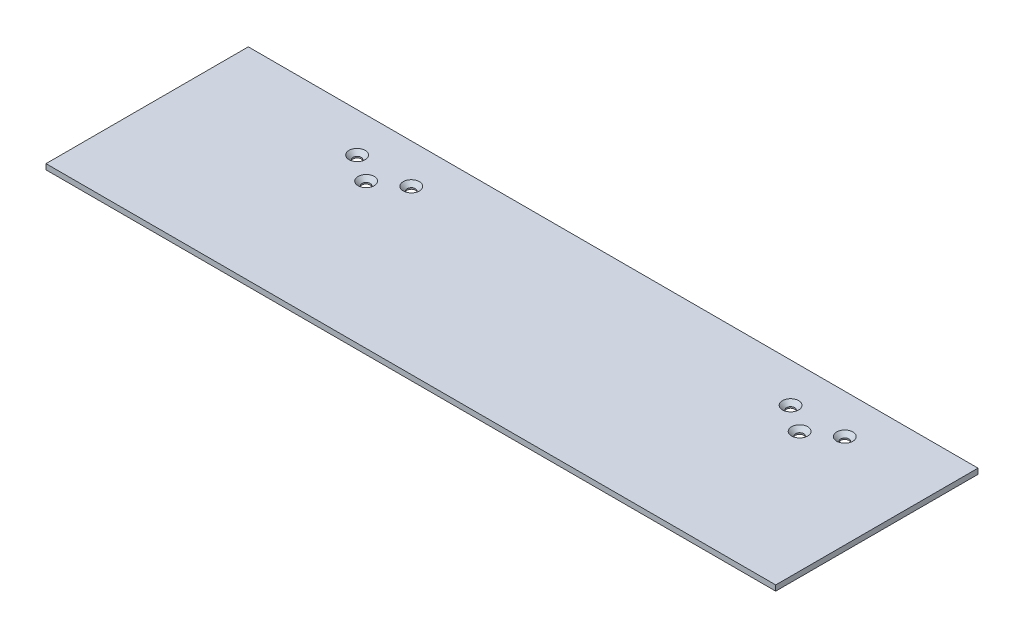
ISO-10303-21;
HEADER;
FILE_DESCRIPTION(('STEP AP214'),'2;1');
FILE_NAME('part.step','',(''),(''),'','','');
FILE_SCHEMA(('AUTOMOTIVE_DESIGN { 1 0 10303 214 1 1 1 1 }'));
ENDSEC;
DATA;
#1=APPLICATION_CONTEXT('core data for automotive mechanical design processes');
#2=APPLICATION_PROTOCOL_DEFINITION('international standard','automotive_design',2000,#1);
#3=PRODUCT_CONTEXT('',#1,'mechanical');
#4=PRODUCT('Part','Part','',(#3));
#5=PRODUCT_RELATED_PRODUCT_CATEGORY('part','',(#4));
#6=PRODUCT_DEFINITION_FORMATION('','',#4);
#7=PRODUCT_DEFINITION_CONTEXT('part definition',#1,'design');
#8=PRODUCT_DEFINITION('design','',#6,#7);
#9=PRODUCT_DEFINITION_SHAPE('','',#8);
#10=(LENGTH_UNIT() NAMED_UNIT(*) SI_UNIT(.MILLI.,.METRE.));
#11=(NAMED_UNIT(*) PLANE_ANGLE_UNIT() SI_UNIT($,.RADIAN.));
#12=(NAMED_UNIT(*) SI_UNIT($,.STERADIAN.) SOLID_ANGLE_UNIT());
#13=UNCERTAINTY_MEASURE_WITH_UNIT(LENGTH_MEASURE(1.E-05),#10,'distance_accuracy_value','');
#14=(GEOMETRIC_REPRESENTATION_CONTEXT(3) GLOBAL_UNCERTAINTY_ASSIGNED_CONTEXT((#13)) GLOBAL_UNIT_ASSIGNED_CONTEXT((#10,
#11,#12)) REPRESENTATION_CONTEXT('',''));
#15=CARTESIAN_POINT('',(0.,0.,0.));
#16=DIRECTION('',(0.,0.,1.));
#17=DIRECTION('',(1.,0.,0.));
#18=AXIS2_PLACEMENT_3D('',#15,#16,#17);
#19=CARTESIAN_POINT('',(0.,3.,0.));
#20=DIRECTION('',(0.,-1.,0.));
#21=DIRECTION('',(0.,0.,-1.));
#22=AXIS2_PLACEMENT_3D('',#19,#20,#21);
#23=PLANE('',#22);
#24=CARTESIAN_POINT('',(-90.,3.,-34.25));
#25=DIRECTION('',(0.,1.,0.));
#26=DIRECTION('',(0.,0.,1.));
#27=AXIS2_PLACEMENT_3D('',#24,#25,#26);
#28=CIRCLE('',#27,4.48000000000001);
#29=CARTESIAN_POINT('',(-90.,3.,-29.77));
#30=VERTEX_POINT('',#29);
#31=EDGE_CURVE('E196',#30,#30,#28,.T.);
#32=ORIENTED_EDGE('',*,*,#31,.F.);
#33=EDGE_LOOP('',(#32));
#34=FACE_BOUND('',#33,.T.);
#35=CARTESIAN_POINT('',(-105.,3.,-24.25));
#36=DIRECTION('',(0.,1.,0.));
#37=DIRECTION('',(0.,0.,1.));
#38=AXIS2_PLACEMENT_3D('',#35,#36,#37);
#39=CIRCLE('',#38,4.48000000000001);
#40=CARTESIAN_POINT('',(-105.,3.,-19.77));
#41=VERTEX_POINT('',#40);
#42=EDGE_CURVE('E184',#41,#41,#39,.T.);
#43=ORIENTED_EDGE('',*,*,#42,.F.);
#44=EDGE_LOOP('',(#43));
#45=FACE_BOUND('',#44,.T.);
#46=CARTESIAN_POINT('',(-120.,3.,-34.25));
#47=DIRECTION('',(0.,1.,0.));
#48=DIRECTION('',(0.,0.,1.));
#49=AXIS2_PLACEMENT_3D('',#46,#47,#48);
#50=CIRCLE('',#49,4.48);
#51=CARTESIAN_POINT('',(-120.,3.,-29.77));
#52=VERTEX_POINT('',#51);
#53=EDGE_CURVE('E172',#52,#52,#50,.T.);
#54=ORIENTED_EDGE('',*,*,#53,.F.);
#55=EDGE_LOOP('',(#54));
#56=FACE_BOUND('',#55,.T.);
#57=CARTESIAN_POINT('',(150.,3.,-34.25));
#58=DIRECTION('',(0.,1.,0.));
#59=DIRECTION('',(0.,0.,1.));
#60=AXIS2_PLACEMENT_3D('',#57,#58,#59);
#61=CIRCLE('',#60,4.48000000000001);
#62=CARTESIAN_POINT('',(150.,3.,-29.77));
#63=VERTEX_POINT('',#62);
#64=EDGE_CURVE('E148',#63,#63,#61,.T.);
#65=ORIENTED_EDGE('',*,*,#64,.F.);
#66=EDGE_LOOP('',(#65));
#67=FACE_BOUND('',#66,.T.);
#68=CARTESIAN_POINT('',(135.,3.,-24.25));
#69=DIRECTION('',(0.,1.,0.));
#70=DIRECTION('',(0.,0.,1.));
#71=AXIS2_PLACEMENT_3D('',#68,#69,#70);
#72=CIRCLE('',#71,4.48000000000001);
#73=CARTESIAN_POINT('',(135.,3.,-19.77));
#74=VERTEX_POINT('',#73);
#75=EDGE_CURVE('E136',#74,#74,#72,.T.);
#76=ORIENTED_EDGE('',*,*,#75,.F.);
#77=EDGE_LOOP('',(#76));
#78=FACE_BOUND('',#77,.T.);
#79=DIRECTION('',(0.,0.,-1.));
#80=VECTOR('',#79,1.);
#81=CARTESIAN_POINT('',(202.,3.,56.));
#82=LINE('',#81,#80);
#83=CARTESIAN_POINT('',(202.,3.,56.));
#84=VERTEX_POINT('',#83);
#85=CARTESIAN_POINT('',(202.,3.,-56.));
#86=VERTEX_POINT('',#85);
#87=EDGE_CURVE('E92',#84,#86,#82,.T.);
#88=ORIENTED_EDGE('',*,*,#87,.T.);
#89=DIRECTION('',(-1.,0.,0.));
#90=VECTOR('',#89,1.);
#91=CARTESIAN_POINT('',(-202.,3.,-56.));
#92=LINE('',#91,#90);
#93=CARTESIAN_POINT('',(-202.,3.,-56.));
#94=VERTEX_POINT('',#93);
#95=EDGE_CURVE('E87',#86,#94,#92,.T.);
#96=ORIENTED_EDGE('',*,*,#95,.T.);
#97=DIRECTION('',(0.,0.,1.));
#98=VECTOR('',#97,1.);
#99=CARTESIAN_POINT('',(-202.,3.,56.));
#100=LINE('',#99,#98);
#101=CARTESIAN_POINT('',(-202.,3.,56.));
#102=VERTEX_POINT('',#101);
#103=EDGE_CURVE('E90',#94,#102,#100,.T.);
#104=ORIENTED_EDGE('',*,*,#103,.T.);
#105=DIRECTION('',(1.,0.,0.));
#106=VECTOR('',#105,1.);
#107=CARTESIAN_POINT('',(-202.,3.,56.));
#108=LINE('',#107,#106);
#109=EDGE_CURVE('E57',#102,#84,#108,.T.);
#110=ORIENTED_EDGE('',*,*,#109,.T.);
#111=EDGE_LOOP('',(#88,#96,#104,#110));
#112=FACE_BOUND('',#111,.T.);
#113=CARTESIAN_POINT('',(120.,3.,-34.25));
#114=DIRECTION('',(0.,1.,0.));
#115=DIRECTION('',(0.,0.,1.));
#116=AXIS2_PLACEMENT_3D('',#113,#114,#115);
#117=CIRCLE('',#116,4.48);
#118=CARTESIAN_POINT('',(120.,3.,-29.77));
#119=VERTEX_POINT('',#118);
#120=EDGE_CURVE('E160',#119,#119,#117,.T.);
#121=ORIENTED_EDGE('',*,*,#120,.F.);
#122=EDGE_LOOP('',(#121));
#123=FACE_BOUND('',#122,.T.);
#124=ADVANCED_FACE('F39',(#34,#45,#56,#67,#78,#112,#123),#23,.F.);
#125=CARTESIAN_POINT('',(202.,3.,56.));
#126=DIRECTION('',(-1.,0.,0.));
#127=DIRECTION('',(0.,0.,1.));
#128=AXIS2_PLACEMENT_3D('',#125,#126,#127);
#129=PLANE('',#128);
#130=DIRECTION('',(0.,0.,-1.));
#131=VECTOR('',#130,1.);
#132=CARTESIAN_POINT('',(202.,0.,56.));
#133=LINE('',#132,#131);
#134=CARTESIAN_POINT('',(202.,0.,56.));
#135=VERTEX_POINT('',#134);
#136=CARTESIAN_POINT('',(202.,0.,-56.));
#137=VERTEX_POINT('',#136);
#138=EDGE_CURVE('E108',#135,#137,#133,.T.);
#139=ORIENTED_EDGE('',*,*,#138,.T.);
#140=DIRECTION('',(0.,-1.,0.));
#141=VECTOR('',#140,1.);
#142=CARTESIAN_POINT('',(202.,3.,-56.));
#143=LINE('',#142,#141);
#144=EDGE_CURVE('E11',#86,#137,#143,.T.);
#145=ORIENTED_EDGE('',*,*,#144,.F.);
#146=ORIENTED_EDGE('',*,*,#87,.F.);
#147=DIRECTION('',(0.,-1.,0.));
#148=VECTOR('',#147,1.);
#149=CARTESIAN_POINT('',(202.,3.,56.));
#150=LINE('',#149,#148);
#151=EDGE_CURVE('E104',#84,#135,#150,.T.);
#152=ORIENTED_EDGE('',*,*,#151,.T.);
#153=EDGE_LOOP('',(#139,#145,#146,#152));
#154=FACE_BOUND('',#153,.T.);
#155=ADVANCED_FACE('F41',(#154),#129,.F.);
#156=CARTESIAN_POINT('',(-202.,3.,-56.));
#157=DIRECTION('',(0.,0.,1.));
#158=DIRECTION('',(1.,0.,0.));
#159=AXIS2_PLACEMENT_3D('',#156,#157,#158);
#160=PLANE('',#159);
#161=DIRECTION('',(-1.,0.,0.));
#162=VECTOR('',#161,1.);
#163=CARTESIAN_POINT('',(-202.,0.,-56.));
#164=LINE('',#163,#162);
#165=CARTESIAN_POINT('',(-202.,0.,-56.));
#166=VERTEX_POINT('',#165);
#167=EDGE_CURVE('E97',#137,#166,#164,.T.);
#168=ORIENTED_EDGE('',*,*,#167,.T.);
#169=DIRECTION('',(0.,-1.,0.));
#170=VECTOR('',#169,1.);
#171=CARTESIAN_POINT('',(-202.,3.,-56.));
#172=LINE('',#171,#170);
#173=EDGE_CURVE('E49',#94,#166,#172,.T.);
#174=ORIENTED_EDGE('',*,*,#173,.F.);
#175=ORIENTED_EDGE('',*,*,#95,.F.);
#176=ORIENTED_EDGE('',*,*,#144,.T.);
#177=EDGE_LOOP('',(#168,#174,#175,#176));
#178=FACE_BOUND('',#177,.T.);
#179=ADVANCED_FACE('F96',(#178),#160,.F.);
#180=CARTESIAN_POINT('',(-202.,3.,56.));
#181=DIRECTION('',(1.,0.,0.));
#182=DIRECTION('',(0.,0.,-1.));
#183=AXIS2_PLACEMENT_3D('',#180,#181,#182);
#184=PLANE('',#183);
#185=DIRECTION('',(0.,0.,1.));
#186=VECTOR('',#185,1.);
#187=CARTESIAN_POINT('',(-202.,0.,56.));
#188=LINE('',#187,#186);
#189=CARTESIAN_POINT('',(-202.,0.,56.));
#190=VERTEX_POINT('',#189);
#191=EDGE_CURVE('E74',#166,#190,#188,.T.);
#192=ORIENTED_EDGE('',*,*,#191,.T.);
#193=DIRECTION('',(0.,-1.,0.));
#194=VECTOR('',#193,1.);
#195=CARTESIAN_POINT('',(-202.,3.,56.));
#196=LINE('',#195,#194);
#197=EDGE_CURVE('E99',#102,#190,#196,.T.);
#198=ORIENTED_EDGE('',*,*,#197,.F.);
#199=ORIENTED_EDGE('',*,*,#103,.F.);
#200=ORIENTED_EDGE('',*,*,#173,.T.);
#201=EDGE_LOOP('',(#192,#198,#199,#200));
#202=FACE_BOUND('',#201,.T.);
#203=ADVANCED_FACE('F100',(#202),#184,.F.);
#204=CARTESIAN_POINT('',(-202.,3.,56.));
#205=DIRECTION('',(0.,0.,-1.));
#206=DIRECTION('',(-1.,0.,0.));
#207=AXIS2_PLACEMENT_3D('',#204,#205,#206);
#208=PLANE('',#207);
#209=DIRECTION('',(1.,0.,0.));
#210=VECTOR('',#209,1.);
#211=CARTESIAN_POINT('',(-202.,0.,56.));
#212=LINE('',#211,#210);
#213=EDGE_CURVE('E80',#190,#135,#212,.T.);
#214=ORIENTED_EDGE('',*,*,#213,.T.);
#215=ORIENTED_EDGE('',*,*,#151,.F.);
#216=ORIENTED_EDGE('',*,*,#109,.F.);
#217=ORIENTED_EDGE('',*,*,#197,.T.);
#218=EDGE_LOOP('',(#214,#215,#216,#217));
#219=FACE_BOUND('',#218,.T.);
#220=ADVANCED_FACE('F122',(#219),#208,.F.);
#221=CARTESIAN_POINT('',(0.,0.,0.));
#222=DIRECTION('',(0.,-1.,0.));
#223=DIRECTION('',(0.,0.,-1.));
#224=AXIS2_PLACEMENT_3D('',#221,#222,#223);
#225=PLANE('',#224);
#226=CARTESIAN_POINT('',(-90.,0.,-34.25));
#227=DIRECTION('',(0.,1.,0.));
#228=DIRECTION('',(0.,0.,1.));
#229=AXIS2_PLACEMENT_3D('',#226,#227,#228);
#230=CIRCLE('',#229,2.24999999999997);
#231=CARTESIAN_POINT('',(-90.,0.,-32.));
#232=VERTEX_POINT('',#231);
#233=EDGE_CURVE('E192',#232,#232,#230,.T.);
#234=ORIENTED_EDGE('',*,*,#233,.T.);
#235=EDGE_LOOP('',(#234));
#236=FACE_BOUND('',#235,.T.);
#237=CARTESIAN_POINT('',(-105.,0.,-24.25));
#238=DIRECTION('',(0.,1.,0.));
#239=DIRECTION('',(0.,0.,1.));
#240=AXIS2_PLACEMENT_3D('',#237,#238,#239);
#241=CIRCLE('',#240,2.24999999999997);
#242=CARTESIAN_POINT('',(-105.,0.,-22.));
#243=VERTEX_POINT('',#242);
#244=EDGE_CURVE('E180',#243,#243,#241,.T.);
#245=ORIENTED_EDGE('',*,*,#244,.T.);
#246=EDGE_LOOP('',(#245));
#247=FACE_BOUND('',#246,.T.);
#248=CARTESIAN_POINT('',(-120.,0.,-34.25));
#249=DIRECTION('',(0.,1.,0.));
#250=DIRECTION('',(0.,0.,1.));
#251=AXIS2_PLACEMENT_3D('',#248,#249,#250);
#252=CIRCLE('',#251,2.24999999999999);
#253=CARTESIAN_POINT('',(-120.,0.,-32.));
#254=VERTEX_POINT('',#253);
#255=EDGE_CURVE('E168',#254,#254,#252,.T.);
#256=ORIENTED_EDGE('',*,*,#255,.T.);
#257=EDGE_LOOP('',(#256));
#258=FACE_BOUND('',#257,.T.);
#259=CARTESIAN_POINT('',(120.,0.,-34.25));
#260=DIRECTION('',(0.,1.,0.));
#261=DIRECTION('',(0.,0.,1.));
#262=AXIS2_PLACEMENT_3D('',#259,#260,#261);
#263=CIRCLE('',#262,2.24999999999999);
#264=CARTESIAN_POINT('',(120.,0.,-32.));
#265=VERTEX_POINT('',#264);
#266=EDGE_CURVE('E152',#265,#265,#263,.T.);
#267=ORIENTED_EDGE('',*,*,#266,.T.);
#268=EDGE_LOOP('',(#267));
#269=FACE_BOUND('',#268,.T.);
#270=CARTESIAN_POINT('',(150.,0.,-34.25));
#271=DIRECTION('',(0.,1.,0.));
#272=DIRECTION('',(0.,0.,1.));
#273=AXIS2_PLACEMENT_3D('',#270,#271,#272);
#274=CIRCLE('',#273,2.24999999999997);
#275=CARTESIAN_POINT('',(150.,0.,-32.));
#276=VERTEX_POINT('',#275);
#277=EDGE_CURVE('E140',#276,#276,#274,.T.);
#278=ORIENTED_EDGE('',*,*,#277,.T.);
#279=EDGE_LOOP('',(#278));
#280=FACE_BOUND('',#279,.T.);
#281=CARTESIAN_POINT('',(135.,0.,-24.25));
#282=DIRECTION('',(0.,1.,0.));
#283=DIRECTION('',(0.,0.,1.));
#284=AXIS2_PLACEMENT_3D('',#281,#282,#283);
#285=CIRCLE('',#284,2.24999999999997);
#286=CARTESIAN_POINT('',(135.,0.,-22.));
#287=VERTEX_POINT('',#286);
#288=EDGE_CURVE('E112',#287,#287,#285,.T.);
#289=ORIENTED_EDGE('',*,*,#288,.T.);
#290=EDGE_LOOP('',(#289));
#291=FACE_BOUND('',#290,.T.);
#292=ORIENTED_EDGE('',*,*,#138,.F.);
#293=ORIENTED_EDGE('',*,*,#213,.F.);
#294=ORIENTED_EDGE('',*,*,#191,.F.);
#295=ORIENTED_EDGE('',*,*,#167,.F.);
#296=EDGE_LOOP('',(#292,#293,#294,#295));
#297=FACE_BOUND('',#296,.T.);
#298=ADVANCED_FACE('F125',(#236,#247,#258,#269,#280,#291,#297),#225,.T.);
#299=CARTESIAN_POINT('',(135.,3.,-24.25));
#300=DIRECTION('',(0.,1.,0.));
#301=DIRECTION('',(0.,0.,1.));
#302=AXIS2_PLACEMENT_3D('',#299,#300,#301);
#303=CYLINDRICAL_SURFACE('',#302,2.24999999999999);
#304=ORIENTED_EDGE('',*,*,#288,.F.);
#305=EDGE_LOOP('',(#304));
#306=FACE_BOUND('',#305,.T.);
#307=CARTESIAN_POINT('',(135.,0.769999999999999,-24.25));
#308=DIRECTION('',(0.,1.,0.));
#309=DIRECTION('',(0.,0.,1.));
#310=AXIS2_PLACEMENT_3D('',#307,#308,#309);
#311=CIRCLE('',#310,2.25);
#312=CARTESIAN_POINT('',(135.,0.769999999999999,-22.));
#313=VERTEX_POINT('',#312);
#314=EDGE_CURVE('E132',#313,#313,#311,.T.);
#315=ORIENTED_EDGE('',*,*,#314,.T.);
#316=EDGE_LOOP('',(#315));
#317=FACE_BOUND('',#316,.T.);
#318=ADVANCED_FACE('F217',(#306,#317),#303,.F.);
#319=CARTESIAN_POINT('',(135.,3.,-24.25));
#320=DIRECTION('',(0.,1.,0.));
#321=DIRECTION('',(0.,0.,1.));
#322=AXIS2_PLACEMENT_3D('',#319,#320,#321);
#323=CONICAL_SURFACE('',#322,4.48000000000001,0.78539816339745);
#324=ORIENTED_EDGE('',*,*,#314,.F.);
#325=EDGE_LOOP('',(#324));
#326=FACE_BOUND('',#325,.T.);
#327=ORIENTED_EDGE('',*,*,#75,.T.);
#328=EDGE_LOOP('',(#327));
#329=FACE_BOUND('',#328,.T.);
#330=ADVANCED_FACE('F214',(#326,#329),#323,.F.);
#331=CARTESIAN_POINT('',(150.,3.,-34.25));
#332=DIRECTION('',(0.,1.,0.));
#333=DIRECTION('',(0.,0.,1.));
#334=AXIS2_PLACEMENT_3D('',#331,#332,#333);
#335=CYLINDRICAL_SURFACE('',#334,2.24999999999999);
#336=ORIENTED_EDGE('',*,*,#277,.F.);
#337=EDGE_LOOP('',(#336));
#338=FACE_BOUND('',#337,.T.);
#339=CARTESIAN_POINT('',(150.,0.769999999999999,-34.25));
#340=DIRECTION('',(0.,1.,0.));
#341=DIRECTION('',(0.,0.,1.));
#342=AXIS2_PLACEMENT_3D('',#339,#340,#341);
#343=CIRCLE('',#342,2.25);
#344=CARTESIAN_POINT('',(150.,0.769999999999999,-32.));
#345=VERTEX_POINT('',#344);
#346=EDGE_CURVE('E144',#345,#345,#343,.T.);
#347=ORIENTED_EDGE('',*,*,#346,.T.);
#348=EDGE_LOOP('',(#347));
#349=FACE_BOUND('',#348,.T.);
#350=ADVANCED_FACE('F216',(#338,#349),#335,.F.);
#351=CARTESIAN_POINT('',(150.,3.,-34.25));
#352=DIRECTION('',(0.,1.,0.));
#353=DIRECTION('',(0.,0.,1.));
#354=AXIS2_PLACEMENT_3D('',#351,#352,#353);
#355=CONICAL_SURFACE('',#354,4.48000000000001,0.78539816339745);
#356=ORIENTED_EDGE('',*,*,#346,.F.);
#357=EDGE_LOOP('',(#356));
#358=FACE_BOUND('',#357,.T.);
#359=ORIENTED_EDGE('',*,*,#64,.T.);
#360=EDGE_LOOP('',(#359));
#361=FACE_BOUND('',#360,.T.);
#362=ADVANCED_FACE('F224',(#358,#361),#355,.F.);
#363=CARTESIAN_POINT('',(120.,3.,-34.25));
#364=DIRECTION('',(0.,1.,0.));
#365=DIRECTION('',(0.,0.,1.));
#366=AXIS2_PLACEMENT_3D('',#363,#364,#365);
#367=CYLINDRICAL_SURFACE('',#366,2.25);
#368=ORIENTED_EDGE('',*,*,#266,.F.);
#369=EDGE_LOOP('',(#368));
#370=FACE_BOUND('',#369,.T.);
#371=CARTESIAN_POINT('',(120.,0.769999999999999,-34.25));
#372=DIRECTION('',(0.,1.,0.));
#373=DIRECTION('',(0.,0.,1.));
#374=AXIS2_PLACEMENT_3D('',#371,#372,#373);
#375=CIRCLE('',#374,2.25);
#376=CARTESIAN_POINT('',(120.,0.769999999999999,-32.));
#377=VERTEX_POINT('',#376);
#378=EDGE_CURVE('E156',#377,#377,#375,.T.);
#379=ORIENTED_EDGE('',*,*,#378,.T.);
#380=EDGE_LOOP('',(#379));
#381=FACE_BOUND('',#380,.T.);
#382=ADVANCED_FACE('F328',(#370,#381),#367,.F.);
#383=CARTESIAN_POINT('',(120.,3.,-34.25));
#384=DIRECTION('',(0.,1.,0.));
#385=DIRECTION('',(0.,0.,1.));
#386=AXIS2_PLACEMENT_3D('',#383,#384,#385);
#387=CONICAL_SURFACE('',#386,4.48,0.785398163397447);
#388=ORIENTED_EDGE('',*,*,#378,.F.);
#389=EDGE_LOOP('',(#388));
#390=FACE_BOUND('',#389,.T.);
#391=ORIENTED_EDGE('',*,*,#120,.T.);
#392=EDGE_LOOP('',(#391));
#393=FACE_BOUND('',#392,.T.);
#394=ADVANCED_FACE('F256',(#390,#393),#387,.F.);
#395=CARTESIAN_POINT('',(-120.,3.,-34.25));
#396=DIRECTION('',(0.,1.,0.));
#397=DIRECTION('',(0.,0.,1.));
#398=AXIS2_PLACEMENT_3D('',#395,#396,#397);
#399=CYLINDRICAL_SURFACE('',#398,2.25);
#400=ORIENTED_EDGE('',*,*,#255,.F.);
#401=EDGE_LOOP('',(#400));
#402=FACE_BOUND('',#401,.T.);
#403=CARTESIAN_POINT('',(-120.,0.769999999999999,-34.25));
#404=DIRECTION('',(0.,1.,0.));
#405=DIRECTION('',(0.,0.,1.));
#406=AXIS2_PLACEMENT_3D('',#403,#404,#405);
#407=CIRCLE('',#406,2.25);
#408=CARTESIAN_POINT('',(-120.,0.769999999999999,-32.));
#409=VERTEX_POINT('',#408);
#410=EDGE_CURVE('E164',#409,#409,#407,.T.);
#411=ORIENTED_EDGE('',*,*,#410,.T.);
#412=EDGE_LOOP('',(#411));
#413=FACE_BOUND('',#412,.T.);
#414=ADVANCED_FACE('F267',(#402,#413),#399,.F.);
#415=CARTESIAN_POINT('',(-120.,3.,-34.25));
#416=DIRECTION('',(0.,1.,0.));
#417=DIRECTION('',(0.,0.,1.));
#418=AXIS2_PLACEMENT_3D('',#415,#416,#417);
#419=CONICAL_SURFACE('',#418,4.48,0.785398163397447);
#420=ORIENTED_EDGE('',*,*,#410,.F.);
#421=EDGE_LOOP('',(#420));
#422=FACE_BOUND('',#421,.T.);
#423=ORIENTED_EDGE('',*,*,#53,.T.);
#424=EDGE_LOOP('',(#423));
#425=FACE_BOUND('',#424,.T.);
#426=ADVANCED_FACE('F272',(#422,#425),#419,.F.);
#427=CARTESIAN_POINT('',(-105.,3.,-24.25));
#428=DIRECTION('',(0.,1.,0.));
#429=DIRECTION('',(0.,0.,1.));
#430=AXIS2_PLACEMENT_3D('',#427,#428,#429);
#431=CYLINDRICAL_SURFACE('',#430,2.24999999999999);
#432=ORIENTED_EDGE('',*,*,#244,.F.);
#433=EDGE_LOOP('',(#432));
#434=FACE_BOUND('',#433,.T.);
#435=CARTESIAN_POINT('',(-105.,0.769999999999999,-24.25));
#436=DIRECTION('',(0.,1.,0.));
#437=DIRECTION('',(0.,0.,1.));
#438=AXIS2_PLACEMENT_3D('',#435,#436,#437);
#439=CIRCLE('',#438,2.25);
#440=CARTESIAN_POINT('',(-105.,0.769999999999999,-22.));
#441=VERTEX_POINT('',#440);
#442=EDGE_CURVE('E176',#441,#441,#439,.T.);
#443=ORIENTED_EDGE('',*,*,#442,.T.);
#444=EDGE_LOOP('',(#443));
#445=FACE_BOUND('',#444,.T.);
#446=ADVANCED_FACE('F282',(#434,#445),#431,.F.);
#447=CARTESIAN_POINT('',(-105.,3.,-24.25));
#448=DIRECTION('',(0.,1.,0.));
#449=DIRECTION('',(0.,0.,1.));
#450=AXIS2_PLACEMENT_3D('',#447,#448,#449);
#451=CONICAL_SURFACE('',#450,4.48000000000001,0.78539816339745);
#452=ORIENTED_EDGE('',*,*,#442,.F.);
#453=EDGE_LOOP('',(#452));
#454=FACE_BOUND('',#453,.T.);
#455=ORIENTED_EDGE('',*,*,#42,.T.);
#456=EDGE_LOOP('',(#455));
#457=FACE_BOUND('',#456,.T.);
#458=ADVANCED_FACE('F292',(#454,#457),#451,.F.);
#459=CARTESIAN_POINT('',(-90.,3.,-34.25));
#460=DIRECTION('',(0.,1.,0.));
#461=DIRECTION('',(0.,0.,1.));
#462=AXIS2_PLACEMENT_3D('',#459,#460,#461);
#463=CYLINDRICAL_SURFACE('',#462,2.24999999999999);
#464=ORIENTED_EDGE('',*,*,#233,.F.);
#465=EDGE_LOOP('',(#464));
#466=FACE_BOUND('',#465,.T.);
#467=CARTESIAN_POINT('',(-90.,0.769999999999999,-34.25));
#468=DIRECTION('',(0.,1.,0.));
#469=DIRECTION('',(0.,0.,1.));
#470=AXIS2_PLACEMENT_3D('',#467,#468,#469);
#471=CIRCLE('',#470,2.25);
#472=CARTESIAN_POINT('',(-90.,0.769999999999999,-32.));
#473=VERTEX_POINT('',#472);
#474=EDGE_CURVE('E188',#473,#473,#471,.T.);
#475=ORIENTED_EDGE('',*,*,#474,.T.);
#476=EDGE_LOOP('',(#475));
#477=FACE_BOUND('',#476,.T.);
#478=ADVANCED_FACE('F302',(#466,#477),#463,.F.);
#479=CARTESIAN_POINT('',(-90.,3.,-34.25));
#480=DIRECTION('',(0.,1.,0.));
#481=DIRECTION('',(0.,0.,1.));
#482=AXIS2_PLACEMENT_3D('',#479,#480,#481);
#483=CONICAL_SURFACE('',#482,4.48000000000001,0.78539816339745);
#484=ORIENTED_EDGE('',*,*,#474,.F.);
#485=EDGE_LOOP('',(#484));
#486=FACE_BOUND('',#485,.T.);
#487=ORIENTED_EDGE('',*,*,#31,.T.);
#488=EDGE_LOOP('',(#487));
#489=FACE_BOUND('',#488,.T.);
#490=ADVANCED_FACE('F201',(#486,#489),#483,.F.);
#491=CLOSED_SHELL('',(#124,#155,#179,#203,#220,#298,#318,#330,#350,#362,#382,#394,#414,#426,
#446,#458,#478,#490));
#492=MANIFOLD_SOLID_BREP('B2',#491);
#493=ADVANCED_BREP_SHAPE_REPRESENTATION('',(#18,#492),#14);
#494=SHAPE_DEFINITION_REPRESENTATION(#9,#493);
ENDSEC;
END-ISO-10303-21;
